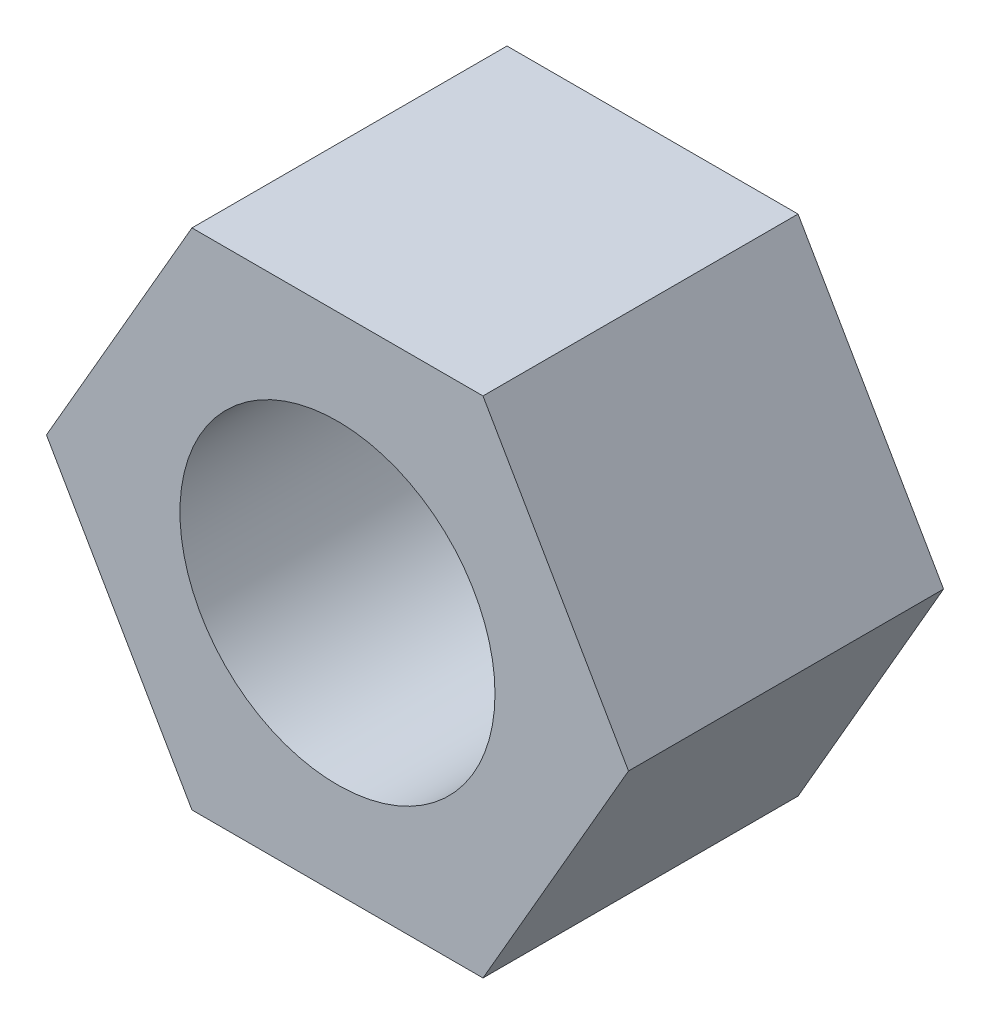
ISO-10303-21;
HEADER;
FILE_DESCRIPTION(('STEP AP214'),'2;1');
FILE_NAME('part.step','',(''),(''),'','','');
FILE_SCHEMA(('AUTOMOTIVE_DESIGN { 1 0 10303 214 1 1 1 1 }'));
ENDSEC;
DATA;
#1=APPLICATION_CONTEXT('core data for automotive mechanical design processes');
#2=APPLICATION_PROTOCOL_DEFINITION('international standard','automotive_design',2000,#1);
#3=PRODUCT_CONTEXT('',#1,'mechanical');
#4=PRODUCT('Part','Part','',(#3));
#5=PRODUCT_RELATED_PRODUCT_CATEGORY('part','',(#4));
#6=PRODUCT_DEFINITION_FORMATION('','',#4);
#7=PRODUCT_DEFINITION_CONTEXT('part definition',#1,'design');
#8=PRODUCT_DEFINITION('design','',#6,#7);
#9=PRODUCT_DEFINITION_SHAPE('','',#8);
#10=(LENGTH_UNIT() NAMED_UNIT(*) SI_UNIT(.MILLI.,.METRE.));
#11=(NAMED_UNIT(*) PLANE_ANGLE_UNIT() SI_UNIT($,.RADIAN.));
#12=(NAMED_UNIT(*) SI_UNIT($,.STERADIAN.) SOLID_ANGLE_UNIT());
#13=UNCERTAINTY_MEASURE_WITH_UNIT(LENGTH_MEASURE(1.E-05),#10,'distance_accuracy_value','');
#14=(GEOMETRIC_REPRESENTATION_CONTEXT(3) GLOBAL_UNCERTAINTY_ASSIGNED_CONTEXT((#13)) GLOBAL_UNIT_ASSIGNED_CONTEXT((#10,
#11,#12)) REPRESENTATION_CONTEXT('',''));
#15=CARTESIAN_POINT('',(0.,0.,0.));
#16=DIRECTION('',(0.,0.,1.));
#17=DIRECTION('',(1.,0.,0.));
#18=AXIS2_PLACEMENT_3D('',#15,#16,#17);
#19=CARTESIAN_POINT('',(2.3094010767585,-4.,-5.));
#20=DIRECTION('',(0.866025403784439,-0.5,0.));
#21=DIRECTION('',(0.5,0.866025403784439,0.));
#22=AXIS2_PLACEMENT_3D('',#19,#20,#21);
#23=PLANE('',#22);
#24=DIRECTION('',(0.5,0.866025403784439,0.));
#25=VECTOR('',#24,1.);
#26=CARTESIAN_POINT('',(2.3094010767585,-4.,0.));
#27=LINE('',#26,#25);
#28=CARTESIAN_POINT('',(2.3094010767585,-4.,0.));
#29=VERTEX_POINT('',#28);
#30=CARTESIAN_POINT('',(4.61880215351701,0.,0.));
#31=VERTEX_POINT('',#30);
#32=EDGE_CURVE('E126',#29,#31,#27,.T.);
#33=ORIENTED_EDGE('',*,*,#32,.F.);
#34=DIRECTION('',(0.,0.,1.));
#35=VECTOR('',#34,1.);
#36=CARTESIAN_POINT('',(2.3094010767585,-4.,-5.));
#37=LINE('',#36,#35);
#38=CARTESIAN_POINT('',(2.3094010767585,-4.,-5.));
#39=VERTEX_POINT('',#38);
#40=EDGE_CURVE('E11',#39,#29,#37,.T.);
#41=ORIENTED_EDGE('',*,*,#40,.F.);
#42=DIRECTION('',(0.5,0.866025403784439,0.));
#43=VECTOR('',#42,1.);
#44=CARTESIAN_POINT('',(2.3094010767585,-4.,-5.));
#45=LINE('',#44,#43);
#46=CARTESIAN_POINT('',(4.61880215351701,0.,-5.));
#47=VERTEX_POINT('',#46);
#48=EDGE_CURVE('E141',#39,#47,#45,.T.);
#49=ORIENTED_EDGE('',*,*,#48,.T.);
#50=DIRECTION('',(0.,0.,1.));
#51=VECTOR('',#50,1.);
#52=CARTESIAN_POINT('',(4.61880215351701,0.,-5.));
#53=LINE('',#52,#51);
#54=EDGE_CURVE('E44',#47,#31,#53,.T.);
#55=ORIENTED_EDGE('',*,*,#54,.T.);
#56=EDGE_LOOP('',(#33,#41,#49,#55));
#57=FACE_BOUND('',#56,.T.);
#58=ADVANCED_FACE('F41',(#57),#23,.T.);
#59=CARTESIAN_POINT('',(-2.30940107675851,-4.,-5.));
#60=DIRECTION('',(0.,-1.,0.));
#61=DIRECTION('',(0.,0.,-1.));
#62=AXIS2_PLACEMENT_3D('',#59,#60,#61);
#63=PLANE('',#62);
#64=DIRECTION('',(1.,0.,0.));
#65=VECTOR('',#64,1.);
#66=CARTESIAN_POINT('',(-2.30940107675851,-4.,0.));
#67=LINE('',#66,#65);
#68=CARTESIAN_POINT('',(-2.30940107675851,-4.,0.));
#69=VERTEX_POINT('',#68);
#70=EDGE_CURVE('E139',#69,#29,#67,.T.);
#71=ORIENTED_EDGE('',*,*,#70,.F.);
#72=DIRECTION('',(0.,0.,1.));
#73=VECTOR('',#72,1.);
#74=CARTESIAN_POINT('',(-2.30940107675851,-4.,-5.));
#75=LINE('',#74,#73);
#76=CARTESIAN_POINT('',(-2.30940107675851,-4.,-5.));
#77=VERTEX_POINT('',#76);
#78=EDGE_CURVE('E50',#77,#69,#75,.T.);
#79=ORIENTED_EDGE('',*,*,#78,.F.);
#80=DIRECTION('',(1.,0.,0.));
#81=VECTOR('',#80,1.);
#82=CARTESIAN_POINT('',(-2.30940107675851,-4.,-5.));
#83=LINE('',#82,#81);
#84=EDGE_CURVE('E116',#77,#39,#83,.T.);
#85=ORIENTED_EDGE('',*,*,#84,.T.);
#86=ORIENTED_EDGE('',*,*,#40,.T.);
#87=EDGE_LOOP('',(#71,#79,#85,#86));
#88=FACE_BOUND('',#87,.T.);
#89=ADVANCED_FACE('F149',(#88),#63,.T.);
#90=CARTESIAN_POINT('',(-4.61880215351701,0.,-5.));
#91=DIRECTION('',(-0.866025403784439,-0.5,0.));
#92=DIRECTION('',(0.5,-0.866025403784439,0.));
#93=AXIS2_PLACEMENT_3D('',#90,#91,#92);
#94=PLANE('',#93);
#95=DIRECTION('',(0.5,-0.866025403784439,0.));
#96=VECTOR('',#95,1.);
#97=CARTESIAN_POINT('',(-4.61880215351701,0.,0.));
#98=LINE('',#97,#96);
#99=CARTESIAN_POINT('',(-4.61880215351701,0.,0.));
#100=VERTEX_POINT('',#99);
#101=EDGE_CURVE('E103',#100,#69,#98,.T.);
#102=ORIENTED_EDGE('',*,*,#101,.F.);
#103=DIRECTION('',(0.,0.,1.));
#104=VECTOR('',#103,1.);
#105=CARTESIAN_POINT('',(-4.61880215351701,0.,-5.));
#106=LINE('',#105,#104);
#107=CARTESIAN_POINT('',(-4.61880215351701,0.,-5.));
#108=VERTEX_POINT('',#107);
#109=EDGE_CURVE('E98',#108,#100,#106,.T.);
#110=ORIENTED_EDGE('',*,*,#109,.F.);
#111=DIRECTION('',(0.5,-0.866025403784439,0.));
#112=VECTOR('',#111,1.);
#113=CARTESIAN_POINT('',(-4.61880215351701,0.,-5.));
#114=LINE('',#113,#112);
#115=EDGE_CURVE('E101',#108,#77,#114,.T.);
#116=ORIENTED_EDGE('',*,*,#115,.T.);
#117=ORIENTED_EDGE('',*,*,#78,.T.);
#118=EDGE_LOOP('',(#102,#110,#116,#117));
#119=FACE_BOUND('',#118,.T.);
#120=ADVANCED_FACE('F100',(#119),#94,.T.);
#121=CARTESIAN_POINT('',(-2.3094010767585,4.,-5.));
#122=DIRECTION('',(-0.866025403784439,0.5,0.));
#123=DIRECTION('',(-0.5,-0.866025403784439,0.));
#124=AXIS2_PLACEMENT_3D('',#121,#122,#123);
#125=PLANE('',#124);
#126=DIRECTION('',(-0.5,-0.866025403784438,0.));
#127=VECTOR('',#126,1.);
#128=CARTESIAN_POINT('',(-2.3094010767585,4.,0.));
#129=LINE('',#128,#127);
#130=CARTESIAN_POINT('',(-2.3094010767585,4.,0.));
#131=VERTEX_POINT('',#130);
#132=EDGE_CURVE('E136',#131,#100,#129,.T.);
#133=ORIENTED_EDGE('',*,*,#132,.F.);
#134=DIRECTION('',(0.,0.,1.));
#135=VECTOR('',#134,1.);
#136=CARTESIAN_POINT('',(-2.3094010767585,4.,-5.));
#137=LINE('',#136,#135);
#138=CARTESIAN_POINT('',(-2.3094010767585,4.,-5.));
#139=VERTEX_POINT('',#138);
#140=EDGE_CURVE('E108',#139,#131,#137,.T.);
#141=ORIENTED_EDGE('',*,*,#140,.F.);
#142=DIRECTION('',(-0.5,-0.866025403784438,0.));
#143=VECTOR('',#142,1.);
#144=CARTESIAN_POINT('',(-2.3094010767585,4.,-5.));
#145=LINE('',#144,#143);
#146=EDGE_CURVE('E114',#139,#108,#145,.T.);
#147=ORIENTED_EDGE('',*,*,#146,.T.);
#148=ORIENTED_EDGE('',*,*,#109,.T.);
#149=EDGE_LOOP('',(#133,#141,#147,#148));
#150=FACE_BOUND('',#149,.T.);
#151=ADVANCED_FACE('F118',(#150),#125,.T.);
#152=CARTESIAN_POINT('',(2.3094010767585,4.,-5.));
#153=DIRECTION('',(0.,1.,0.));
#154=DIRECTION('',(-1.,0.,0.));
#155=AXIS2_PLACEMENT_3D('',#152,#153,#154);
#156=PLANE('',#155);
#157=DIRECTION('',(-1.,0.,0.));
#158=VECTOR('',#157,1.);
#159=CARTESIAN_POINT('',(2.3094010767585,4.,0.));
#160=LINE('',#159,#158);
#161=CARTESIAN_POINT('',(2.3094010767585,4.,0.));
#162=VERTEX_POINT('',#161);
#163=EDGE_CURVE('E133',#162,#131,#160,.T.);
#164=ORIENTED_EDGE('',*,*,#163,.F.);
#165=DIRECTION('',(0.,0.,1.));
#166=VECTOR('',#165,1.);
#167=CARTESIAN_POINT('',(2.3094010767585,4.,-5.));
#168=LINE('',#167,#166);
#169=CARTESIAN_POINT('',(2.3094010767585,4.,-5.));
#170=VERTEX_POINT('',#169);
#171=EDGE_CURVE('E144',#170,#162,#168,.T.);
#172=ORIENTED_EDGE('',*,*,#171,.F.);
#173=DIRECTION('',(-1.,0.,0.));
#174=VECTOR('',#173,1.);
#175=CARTESIAN_POINT('',(2.3094010767585,4.,-5.));
#176=LINE('',#175,#174);
#177=EDGE_CURVE('E119',#170,#139,#176,.T.);
#178=ORIENTED_EDGE('',*,*,#177,.T.);
#179=ORIENTED_EDGE('',*,*,#140,.T.);
#180=EDGE_LOOP('',(#164,#172,#178,#179));
#181=FACE_BOUND('',#180,.T.);
#182=ADVANCED_FACE('F162',(#181),#156,.T.);
#183=CARTESIAN_POINT('',(4.61880215351701,0.,-5.));
#184=DIRECTION('',(0.866025403784439,0.5,0.));
#185=DIRECTION('',(-0.5,0.866025403784439,0.));
#186=AXIS2_PLACEMENT_3D('',#183,#184,#185);
#187=PLANE('',#186);
#188=DIRECTION('',(-0.5,0.866025403784439,0.));
#189=VECTOR('',#188,1.);
#190=CARTESIAN_POINT('',(4.61880215351701,0.,0.));
#191=LINE('',#190,#189);
#192=EDGE_CURVE('E129',#31,#162,#191,.T.);
#193=ORIENTED_EDGE('',*,*,#192,.F.);
#194=ORIENTED_EDGE('',*,*,#54,.F.);
#195=DIRECTION('',(-0.5,0.866025403784439,0.));
#196=VECTOR('',#195,1.);
#197=CARTESIAN_POINT('',(4.61880215351701,0.,-5.));
#198=LINE('',#197,#196);
#199=EDGE_CURVE('E121',#47,#170,#198,.T.);
#200=ORIENTED_EDGE('',*,*,#199,.T.);
#201=ORIENTED_EDGE('',*,*,#171,.T.);
#202=EDGE_LOOP('',(#193,#194,#200,#201));
#203=FACE_BOUND('',#202,.T.);
#204=ADVANCED_FACE('F146',(#203),#187,.T.);
#205=CARTESIAN_POINT('',(0.,0.,-5.));
#206=DIRECTION('',(0.,0.,1.));
#207=DIRECTION('',(1.,0.,0.));
#208=AXIS2_PLACEMENT_3D('',#205,#206,#207);
#209=PLANE('',#208);
#210=CARTESIAN_POINT('',(0.,0.,-5.));
#211=DIRECTION('',(0.,0.,1.));
#212=DIRECTION('',(1.,0.,0.));
#213=AXIS2_PLACEMENT_3D('',#210,#211,#212);
#214=CIRCLE('',#213,2.5);
#215=CARTESIAN_POINT('',(2.5,0.,-5.));
#216=VERTEX_POINT('',#215);
#217=EDGE_CURVE('E130',#216,#216,#214,.T.);
#218=ORIENTED_EDGE('',*,*,#217,.T.);
#219=EDGE_LOOP('',(#218));
#220=FACE_BOUND('',#219,.T.);
#221=ORIENTED_EDGE('',*,*,#48,.F.);
#222=ORIENTED_EDGE('',*,*,#84,.F.);
#223=ORIENTED_EDGE('',*,*,#115,.F.);
#224=ORIENTED_EDGE('',*,*,#146,.F.);
#225=ORIENTED_EDGE('',*,*,#177,.F.);
#226=ORIENTED_EDGE('',*,*,#199,.F.);
#227=EDGE_LOOP('',(#221,#222,#223,#224,#225,#226));
#228=FACE_BOUND('',#227,.T.);
#229=ADVANCED_FACE('F112',(#220,#228),#209,.F.);
#230=CARTESIAN_POINT('',(0.,0.,0.));
#231=DIRECTION('',(0.,0.,1.));
#232=DIRECTION('',(1.,0.,0.));
#233=AXIS2_PLACEMENT_3D('',#230,#231,#232);
#234=PLANE('',#233);
#235=CARTESIAN_POINT('',(0.,0.,0.));
#236=DIRECTION('',(0.,0.,1.));
#237=DIRECTION('',(1.,0.,0.));
#238=AXIS2_PLACEMENT_3D('',#235,#236,#237);
#239=CIRCLE('',#238,2.5);
#240=CARTESIAN_POINT('',(2.5,0.,0.));
#241=VERTEX_POINT('',#240);
#242=EDGE_CURVE('E185',#241,#241,#239,.T.);
#243=ORIENTED_EDGE('',*,*,#242,.F.);
#244=EDGE_LOOP('',(#243));
#245=FACE_BOUND('',#244,.T.);
#246=ORIENTED_EDGE('',*,*,#32,.T.);
#247=ORIENTED_EDGE('',*,*,#192,.T.);
#248=ORIENTED_EDGE('',*,*,#163,.T.);
#249=ORIENTED_EDGE('',*,*,#132,.T.);
#250=ORIENTED_EDGE('',*,*,#101,.T.);
#251=ORIENTED_EDGE('',*,*,#70,.T.);
#252=EDGE_LOOP('',(#246,#247,#248,#249,#250,#251));
#253=FACE_BOUND('',#252,.T.);
#254=ADVANCED_FACE('F148',(#245,#253),#234,.T.);
#255=CARTESIAN_POINT('',(0.,0.,-5.));
#256=DIRECTION('',(0.,0.,1.));
#257=DIRECTION('',(1.,0.,0.));
#258=AXIS2_PLACEMENT_3D('',#255,#256,#257);
#259=CYLINDRICAL_SURFACE('',#258,2.5);
#260=ORIENTED_EDGE('',*,*,#217,.F.);
#261=EDGE_LOOP('',(#260));
#262=FACE_BOUND('',#261,.T.);
#263=ORIENTED_EDGE('',*,*,#242,.T.);
#264=EDGE_LOOP('',(#263));
#265=FACE_BOUND('',#264,.T.);
#266=ADVANCED_FACE('F173',(#262,#265),#259,.F.);
#267=CLOSED_SHELL('',(#58,#89,#120,#151,#182,#204,#229,#254,#266));
#268=MANIFOLD_SOLID_BREP('B2',#267);
#269=ADVANCED_BREP_SHAPE_REPRESENTATION('',(#18,#268),#14);
#270=SHAPE_DEFINITION_REPRESENTATION(#9,#269);
ENDSEC;
END-ISO-10303-21;
